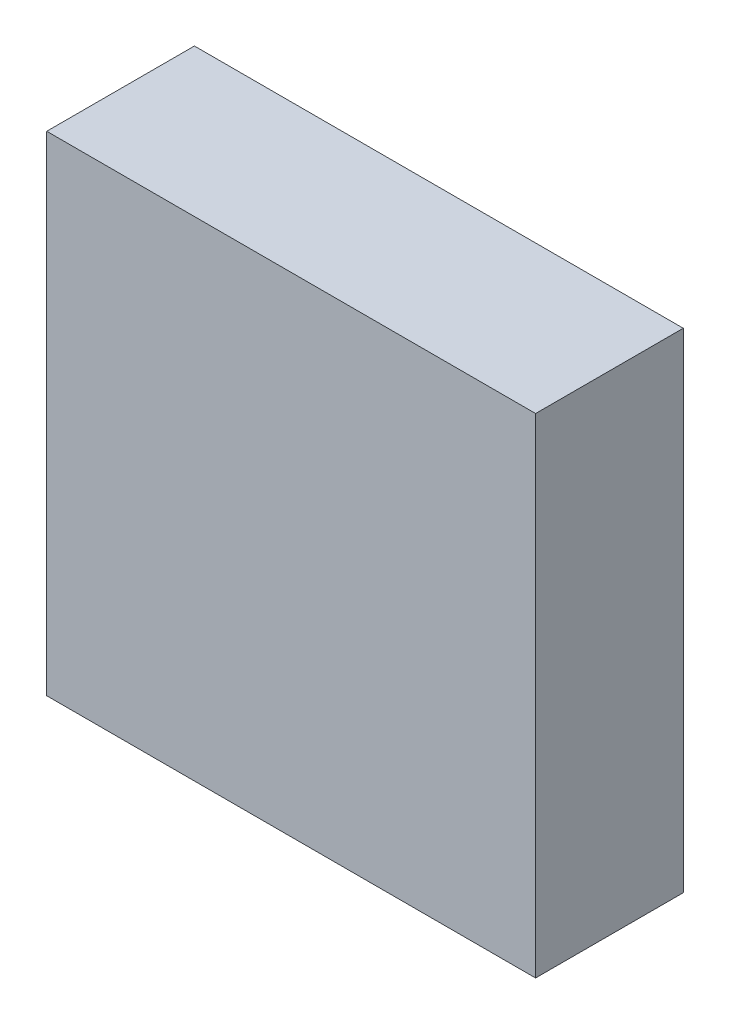
ISO-10303-21;
HEADER;
FILE_DESCRIPTION(('STEP AP214'),'2;1');
FILE_NAME('part.step','',(''),(''),'','','');
FILE_SCHEMA(('AUTOMOTIVE_DESIGN { 1 0 10303 214 1 1 1 1 }'));
ENDSEC;
DATA;
#1=APPLICATION_CONTEXT('core data for automotive mechanical design processes');
#2=APPLICATION_PROTOCOL_DEFINITION('international standard','automotive_design',2000,#1);
#3=PRODUCT_CONTEXT('',#1,'mechanical');
#4=PRODUCT('Part','Part','',(#3));
#5=PRODUCT_RELATED_PRODUCT_CATEGORY('part','',(#4));
#6=PRODUCT_DEFINITION_FORMATION('','',#4);
#7=PRODUCT_DEFINITION_CONTEXT('part definition',#1,'design');
#8=PRODUCT_DEFINITION('design','',#6,#7);
#9=PRODUCT_DEFINITION_SHAPE('','',#8);
#10=(LENGTH_UNIT() NAMED_UNIT(*) SI_UNIT(.MILLI.,.METRE.));
#11=(NAMED_UNIT(*) PLANE_ANGLE_UNIT() SI_UNIT($,.RADIAN.));
#12=(NAMED_UNIT(*) SI_UNIT($,.STERADIAN.) SOLID_ANGLE_UNIT());
#13=UNCERTAINTY_MEASURE_WITH_UNIT(LENGTH_MEASURE(1.E-05),#10,'distance_accuracy_value','');
#14=(GEOMETRIC_REPRESENTATION_CONTEXT(3) GLOBAL_UNCERTAINTY_ASSIGNED_CONTEXT((#13)) GLOBAL_UNIT_ASSIGNED_CONTEXT((#10,
#11,#12)) REPRESENTATION_CONTEXT('',''));
#15=CARTESIAN_POINT('',(0.,0.,0.));
#16=DIRECTION('',(0.,0.,1.));
#17=DIRECTION('',(1.,0.,0.));
#18=AXIS2_PLACEMENT_3D('',#15,#16,#17);
#19=CARTESIAN_POINT('',(0.,36.,10.8752383361));
#20=DIRECTION('',(1.,0.,0.));
#21=DIRECTION('',(0.,0.,-1.));
#22=AXIS2_PLACEMENT_3D('',#19,#20,#21);
#23=PLANE('',#22);
#24=DIRECTION('',(0.,-1.,0.));
#25=VECTOR('',#24,1.);
#26=CARTESIAN_POINT('',(0.,36.,0.));
#27=LINE('',#26,#25);
#28=CARTESIAN_POINT('',(0.,36.,0.));
#29=VERTEX_POINT('',#28);
#30=CARTESIAN_POINT('',(0.,0.,0.));
#31=VERTEX_POINT('',#30);
#32=EDGE_CURVE('E102',#29,#31,#27,.T.);
#33=ORIENTED_EDGE('',*,*,#32,.T.);
#34=DIRECTION('',(0.,0.,-1.));
#35=VECTOR('',#34,1.);
#36=CARTESIAN_POINT('',(0.,0.,10.8752383361));
#37=LINE('',#36,#35);
#38=CARTESIAN_POINT('',(0.,0.,10.8752383361));
#39=VERTEX_POINT('',#38);
#40=EDGE_CURVE('E11',#39,#31,#37,.T.);
#41=ORIENTED_EDGE('',*,*,#40,.F.);
#42=DIRECTION('',(0.,-1.,0.));
#43=VECTOR('',#42,1.);
#44=CARTESIAN_POINT('',(0.,36.,10.8752383361));
#45=LINE('',#44,#43);
#46=CARTESIAN_POINT('',(0.,36.,10.8752383361));
#47=VERTEX_POINT('',#46);
#48=EDGE_CURVE('E90',#47,#39,#45,.T.);
#49=ORIENTED_EDGE('',*,*,#48,.F.);
#50=DIRECTION('',(0.,0.,-1.));
#51=VECTOR('',#50,1.);
#52=CARTESIAN_POINT('',(0.,36.,10.8752383361));
#53=LINE('',#52,#51);
#54=EDGE_CURVE('E98',#47,#29,#53,.T.);
#55=ORIENTED_EDGE('',*,*,#54,.T.);
#56=EDGE_LOOP('',(#33,#41,#49,#55));
#57=FACE_BOUND('',#56,.T.);
#58=ADVANCED_FACE('F39',(#57),#23,.F.);
#59=CARTESIAN_POINT('',(0.,0.,10.8752383361));
#60=DIRECTION('',(0.,1.,0.));
#61=DIRECTION('',(0.,0.,1.));
#62=AXIS2_PLACEMENT_3D('',#59,#60,#61);
#63=PLANE('',#62);
#64=DIRECTION('',(1.,0.,0.));
#65=VECTOR('',#64,1.);
#66=CARTESIAN_POINT('',(0.,0.,0.));
#67=LINE('',#66,#65);
#68=CARTESIAN_POINT('',(36.,0.,0.));
#69=VERTEX_POINT('',#68);
#70=EDGE_CURVE('E94',#31,#69,#67,.T.);
#71=ORIENTED_EDGE('',*,*,#70,.T.);
#72=DIRECTION('',(0.,0.,-1.));
#73=VECTOR('',#72,1.);
#74=CARTESIAN_POINT('',(36.,0.,10.8752383361));
#75=LINE('',#74,#73);
#76=CARTESIAN_POINT('',(36.,0.,10.8752383361));
#77=VERTEX_POINT('',#76);
#78=EDGE_CURVE('E47',#77,#69,#75,.T.);
#79=ORIENTED_EDGE('',*,*,#78,.F.);
#80=DIRECTION('',(1.,0.,0.));
#81=VECTOR('',#80,1.);
#82=CARTESIAN_POINT('',(0.,0.,10.8752383361));
#83=LINE('',#82,#81);
#84=EDGE_CURVE('E85',#39,#77,#83,.T.);
#85=ORIENTED_EDGE('',*,*,#84,.F.);
#86=ORIENTED_EDGE('',*,*,#40,.T.);
#87=EDGE_LOOP('',(#71,#79,#85,#86));
#88=FACE_BOUND('',#87,.T.);
#89=ADVANCED_FACE('F93',(#88),#63,.F.);
#90=CARTESIAN_POINT('',(36.,0.,10.8752383361));
#91=DIRECTION('',(-1.,0.,0.));
#92=DIRECTION('',(0.,0.,1.));
#93=AXIS2_PLACEMENT_3D('',#90,#91,#92);
#94=PLANE('',#93);
#95=DIRECTION('',(0.,1.,0.));
#96=VECTOR('',#95,1.);
#97=CARTESIAN_POINT('',(36.,0.,0.));
#98=LINE('',#97,#96);
#99=CARTESIAN_POINT('',(36.,36.,0.));
#100=VERTEX_POINT('',#99);
#101=EDGE_CURVE('E72',#69,#100,#98,.T.);
#102=ORIENTED_EDGE('',*,*,#101,.T.);
#103=DIRECTION('',(0.,0.,-1.));
#104=VECTOR('',#103,1.);
#105=CARTESIAN_POINT('',(36.,36.,10.8752383361));
#106=LINE('',#105,#104);
#107=CARTESIAN_POINT('',(36.,36.,10.8752383361));
#108=VERTEX_POINT('',#107);
#109=EDGE_CURVE('E95',#108,#100,#106,.T.);
#110=ORIENTED_EDGE('',*,*,#109,.F.);
#111=DIRECTION('',(0.,1.,0.));
#112=VECTOR('',#111,1.);
#113=CARTESIAN_POINT('',(36.,0.,10.8752383361));
#114=LINE('',#113,#112);
#115=EDGE_CURVE('E88',#77,#108,#114,.T.);
#116=ORIENTED_EDGE('',*,*,#115,.F.);
#117=ORIENTED_EDGE('',*,*,#78,.T.);
#118=EDGE_LOOP('',(#102,#110,#116,#117));
#119=FACE_BOUND('',#118,.T.);
#120=ADVANCED_FACE('F96',(#119),#94,.F.);
#121=CARTESIAN_POINT('',(36.,36.,10.8752383361));
#122=DIRECTION('',(0.,-1.,0.));
#123=DIRECTION('',(0.,0.,-1.));
#124=AXIS2_PLACEMENT_3D('',#121,#122,#123);
#125=PLANE('',#124);
#126=DIRECTION('',(-1.,0.,0.));
#127=VECTOR('',#126,1.);
#128=CARTESIAN_POINT('',(36.,36.,0.));
#129=LINE('',#128,#127);
#130=EDGE_CURVE('E78',#100,#29,#129,.T.);
#131=ORIENTED_EDGE('',*,*,#130,.T.);
#132=ORIENTED_EDGE('',*,*,#54,.F.);
#133=DIRECTION('',(-1.,0.,0.));
#134=VECTOR('',#133,1.);
#135=CARTESIAN_POINT('',(36.,36.,10.8752383361));
#136=LINE('',#135,#134);
#137=EDGE_CURVE('E55',#108,#47,#136,.T.);
#138=ORIENTED_EDGE('',*,*,#137,.F.);
#139=ORIENTED_EDGE('',*,*,#109,.T.);
#140=EDGE_LOOP('',(#131,#132,#138,#139));
#141=FACE_BOUND('',#140,.T.);
#142=ADVANCED_FACE('F109',(#141),#125,.F.);
#143=CARTESIAN_POINT('',(0.,0.,10.8752383361));
#144=DIRECTION('',(0.,0.,1.));
#145=DIRECTION('',(1.,0.,0.));
#146=AXIS2_PLACEMENT_3D('',#143,#144,#145);
#147=PLANE('',#146);
#148=ORIENTED_EDGE('',*,*,#48,.T.);
#149=ORIENTED_EDGE('',*,*,#84,.T.);
#150=ORIENTED_EDGE('',*,*,#115,.T.);
#151=ORIENTED_EDGE('',*,*,#137,.T.);
#152=EDGE_LOOP('',(#148,#149,#150,#151));
#153=FACE_BOUND('',#152,.T.);
#154=ADVANCED_FACE('F86',(#153),#147,.T.);
#155=CARTESIAN_POINT('',(0.,0.,0.));
#156=DIRECTION('',(0.,0.,1.));
#157=DIRECTION('',(1.,0.,0.));
#158=AXIS2_PLACEMENT_3D('',#155,#156,#157);
#159=PLANE('',#158);
#160=ORIENTED_EDGE('',*,*,#32,.F.);
#161=ORIENTED_EDGE('',*,*,#130,.F.);
#162=ORIENTED_EDGE('',*,*,#101,.F.);
#163=ORIENTED_EDGE('',*,*,#70,.F.);
#164=EDGE_LOOP('',(#160,#161,#162,#163));
#165=FACE_BOUND('',#164,.T.);
#166=ADVANCED_FACE('F112',(#165),#159,.F.);
#167=CLOSED_SHELL('',(#58,#89,#120,#142,#154,#166));
#168=MANIFOLD_SOLID_BREP('B2',#167);
#169=ADVANCED_BREP_SHAPE_REPRESENTATION('',(#18,#168),#14);
#170=SHAPE_DEFINITION_REPRESENTATION(#9,#169);
ENDSEC;
END-ISO-10303-21;
